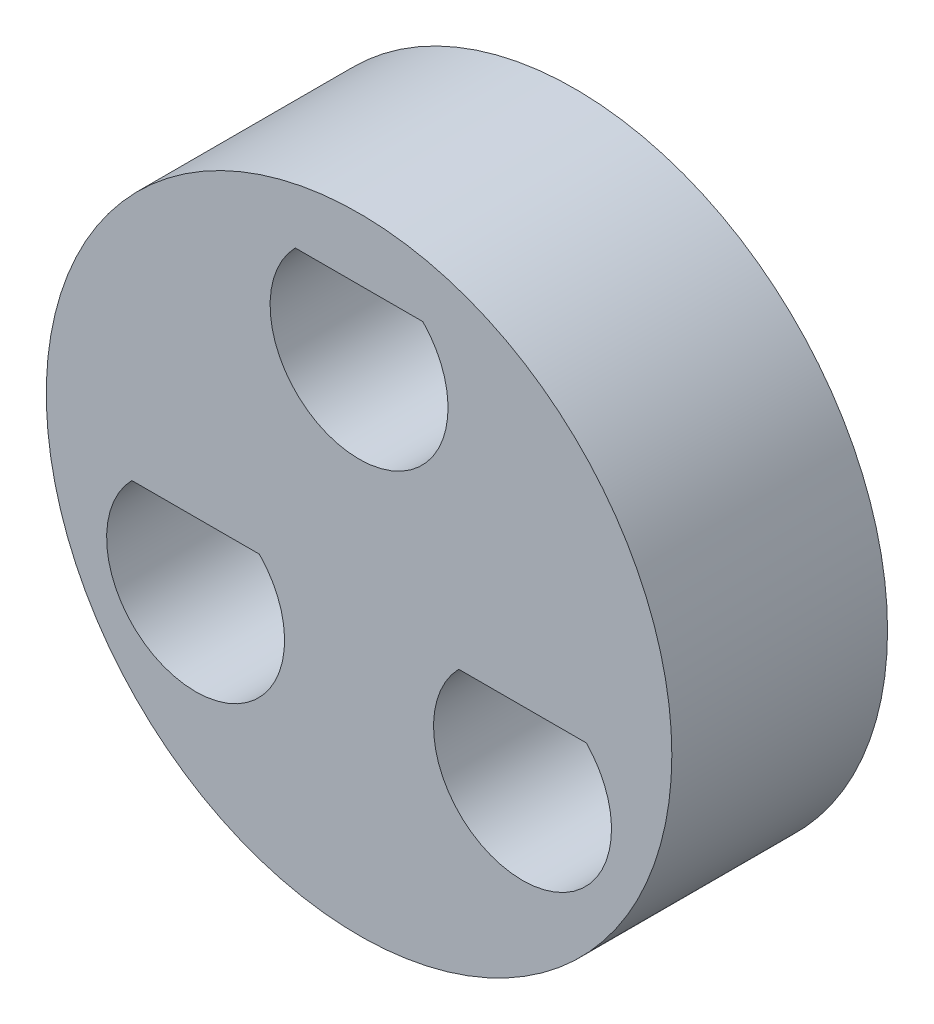
ISO-10303-21;
HEADER;
FILE_DESCRIPTION(('STEP AP214'),'2;1');
FILE_NAME('part.step','',(''),(''),'','','');
FILE_SCHEMA(('AUTOMOTIVE_DESIGN { 1 0 10303 214 1 1 1 1 }'));
ENDSEC;
DATA;
#1=APPLICATION_CONTEXT('core data for automotive mechanical design processes');
#2=APPLICATION_PROTOCOL_DEFINITION('international standard','automotive_design',2000,#1);
#3=PRODUCT_CONTEXT('',#1,'mechanical');
#4=PRODUCT('Part','Part','',(#3));
#5=PRODUCT_RELATED_PRODUCT_CATEGORY('part','',(#4));
#6=PRODUCT_DEFINITION_FORMATION('','',#4);
#7=PRODUCT_DEFINITION_CONTEXT('part definition',#1,'design');
#8=PRODUCT_DEFINITION('design','',#6,#7);
#9=PRODUCT_DEFINITION_SHAPE('','',#8);
#10=(LENGTH_UNIT() NAMED_UNIT(*) SI_UNIT(.MILLI.,.METRE.));
#11=(NAMED_UNIT(*) PLANE_ANGLE_UNIT() SI_UNIT($,.RADIAN.));
#12=(NAMED_UNIT(*) SI_UNIT($,.STERADIAN.) SOLID_ANGLE_UNIT());
#13=UNCERTAINTY_MEASURE_WITH_UNIT(LENGTH_MEASURE(1.E-05),#10,'distance_accuracy_value','');
#14=(GEOMETRIC_REPRESENTATION_CONTEXT(3) GLOBAL_UNCERTAINTY_ASSIGNED_CONTEXT((#13)) GLOBAL_UNIT_ASSIGNED_CONTEXT((#10,
#11,#12)) REPRESENTATION_CONTEXT('',''));
#15=CARTESIAN_POINT('',(0.,0.,0.));
#16=DIRECTION('',(0.,0.,1.));
#17=DIRECTION('',(1.,0.,0.));
#18=AXIS2_PLACEMENT_3D('',#15,#16,#17);
#19=CARTESIAN_POINT('',(0.,0.,-2.));
#20=DIRECTION('',(0.,0.,1.));
#21=DIRECTION('',(1.,0.,0.));
#22=AXIS2_PLACEMENT_3D('',#19,#20,#21);
#23=PLANE('',#22);
#24=DIRECTION('',(1.,0.,0.));
#25=VECTOR('',#24,1.);
#26=CARTESIAN_POINT('',(0.,-0.600000000000015,-2.));
#27=LINE('',#26,#25);
#28=CARTESIAN_POINT('',(-4.21430486986545,-0.600000000000015,-2.));
#29=VERTEX_POINT('',#28);
#30=CARTESIAN_POINT('',(-1.8478729566256,-0.600000000000015,-2.));
#31=VERTEX_POINT('',#30);
#32=EDGE_CURVE('E101',#29,#31,#27,.T.);
#33=ORIENTED_EDGE('',*,*,#32,.F.);
#34=CARTESIAN_POINT('',(-3.03108891324553,-1.75000000000001,-2.));
#35=DIRECTION('',(0.,0.,1.));
#36=DIRECTION('',(1.,0.,0.));
#37=AXIS2_PLACEMENT_3D('',#34,#35,#36);
#38=CIRCLE('',#37,1.65);
#39=EDGE_CURVE('E107',#29,#31,#38,.T.);
#40=ORIENTED_EDGE('',*,*,#39,.T.);
#41=EDGE_LOOP('',(#33,#40));
#42=FACE_BOUND('',#41,.T.);
#43=CARTESIAN_POINT('',(3.03108891324553,-1.75000000000001,-2.));
#44=DIRECTION('',(0.,0.,1.));
#45=DIRECTION('',(1.,0.,0.));
#46=AXIS2_PLACEMENT_3D('',#43,#44,#45);
#47=CIRCLE('',#46,1.65);
#48=CARTESIAN_POINT('',(1.8478729566256,-0.600000000000015,-2.));
#49=VERTEX_POINT('',#48);
#50=CARTESIAN_POINT('',(4.21430486986545,-0.600000000000014,-2.));
#51=VERTEX_POINT('',#50);
#52=EDGE_CURVE('E149',#49,#51,#47,.T.);
#53=ORIENTED_EDGE('',*,*,#52,.T.);
#54=DIRECTION('',(-1.,0.,0.));
#55=VECTOR('',#54,1.);
#56=CARTESIAN_POINT('',(0.,-0.600000000000016,-2.));
#57=LINE('',#56,#55);
#58=EDGE_CURVE('E145',#51,#49,#57,.T.);
#59=ORIENTED_EDGE('',*,*,#58,.T.);
#60=EDGE_LOOP('',(#53,#59));
#61=FACE_BOUND('',#60,.T.);
#62=CARTESIAN_POINT('',(0.,0.,-2.));
#63=DIRECTION('',(0.,0.,1.));
#64=DIRECTION('',(1.,0.,0.));
#65=AXIS2_PLACEMENT_3D('',#62,#63,#64);
#66=CIRCLE('',#65,5.8);
#67=CARTESIAN_POINT('',(5.8,0.,-2.));
#68=VERTEX_POINT('',#67);
#69=EDGE_CURVE('E11',#68,#68,#66,.T.);
#70=ORIENTED_EDGE('',*,*,#69,.F.);
#71=EDGE_LOOP('',(#70));
#72=FACE_BOUND('',#71,.T.);
#73=DIRECTION('',(1.,0.,0.));
#74=VECTOR('',#73,1.);
#75=CARTESIAN_POINT('',(0.,4.65,-2.));
#76=LINE('',#75,#74);
#77=CARTESIAN_POINT('',(-1.18321595661992,4.65,-2.));
#78=VERTEX_POINT('',#77);
#79=CARTESIAN_POINT('',(1.18321595661992,4.65,-2.));
#80=VERTEX_POINT('',#79);
#81=EDGE_CURVE('E125',#78,#80,#76,.T.);
#82=ORIENTED_EDGE('',*,*,#81,.F.);
#83=CARTESIAN_POINT('',(0.,3.5,-2.));
#84=DIRECTION('',(0.,0.,1.));
#85=DIRECTION('',(1.,0.,0.));
#86=AXIS2_PLACEMENT_3D('',#83,#84,#85);
#87=CIRCLE('',#86,1.65);
#88=EDGE_CURVE('E128',#78,#80,#87,.T.);
#89=ORIENTED_EDGE('',*,*,#88,.T.);
#90=EDGE_LOOP('',(#82,#89));
#91=FACE_BOUND('',#90,.T.);
#92=ADVANCED_FACE('F43',(#42,#61,#72,#91),#23,.F.);
#93=CARTESIAN_POINT('',(0.,0.,2.));
#94=DIRECTION('',(0.,0.,1.));
#95=DIRECTION('',(1.,0.,0.));
#96=AXIS2_PLACEMENT_3D('',#93,#94,#95);
#97=PLANE('',#96);
#98=DIRECTION('',(-1.,0.,0.));
#99=VECTOR('',#98,1.);
#100=CARTESIAN_POINT('',(0.,-0.600000000000016,2.));
#101=LINE('',#100,#99);
#102=CARTESIAN_POINT('',(4.21430486986545,-0.600000000000015,2.));
#103=VERTEX_POINT('',#102);
#104=CARTESIAN_POINT('',(1.8478729566256,-0.600000000000015,2.));
#105=VERTEX_POINT('',#104);
#106=EDGE_CURVE('E123',#103,#105,#101,.T.);
#107=ORIENTED_EDGE('',*,*,#106,.F.);
#108=CARTESIAN_POINT('',(3.03108891324553,-1.75000000000001,2.));
#109=DIRECTION('',(0.,0.,1.));
#110=DIRECTION('',(1.,0.,0.));
#111=AXIS2_PLACEMENT_3D('',#108,#109,#110);
#112=CIRCLE('',#111,1.65);
#113=EDGE_CURVE('E150',#105,#103,#112,.T.);
#114=ORIENTED_EDGE('',*,*,#113,.F.);
#115=EDGE_LOOP('',(#107,#114));
#116=FACE_BOUND('',#115,.T.);
#117=CARTESIAN_POINT('',(0.,0.,2.));
#118=DIRECTION('',(0.,0.,1.));
#119=DIRECTION('',(1.,0.,0.));
#120=AXIS2_PLACEMENT_3D('',#117,#118,#119);
#121=CIRCLE('',#120,5.8);
#122=CARTESIAN_POINT('',(5.8,0.,2.));
#123=VERTEX_POINT('',#122);
#124=EDGE_CURVE('E47',#123,#123,#121,.T.);
#125=ORIENTED_EDGE('',*,*,#124,.T.);
#126=EDGE_LOOP('',(#125));
#127=FACE_BOUND('',#126,.T.);
#128=CARTESIAN_POINT('',(-3.03108891324553,-1.75000000000001,2.));
#129=DIRECTION('',(0.,0.,1.));
#130=DIRECTION('',(1.,0.,0.));
#131=AXIS2_PLACEMENT_3D('',#128,#129,#130);
#132=CIRCLE('',#131,1.65);
#133=CARTESIAN_POINT('',(-4.21430486986545,-0.600000000000014,2.));
#134=VERTEX_POINT('',#133);
#135=CARTESIAN_POINT('',(-1.8478729566256,-0.600000000000015,2.));
#136=VERTEX_POINT('',#135);
#137=EDGE_CURVE('E115',#134,#136,#132,.T.);
#138=ORIENTED_EDGE('',*,*,#137,.F.);
#139=DIRECTION('',(1.,0.,0.));
#140=VECTOR('',#139,1.);
#141=CARTESIAN_POINT('',(0.,-0.600000000000015,2.));
#142=LINE('',#141,#140);
#143=EDGE_CURVE('E104',#134,#136,#142,.T.);
#144=ORIENTED_EDGE('',*,*,#143,.T.);
#145=EDGE_LOOP('',(#138,#144));
#146=FACE_BOUND('',#145,.T.);
#147=CARTESIAN_POINT('',(0.,3.5,2.));
#148=DIRECTION('',(0.,0.,1.));
#149=DIRECTION('',(1.,0.,0.));
#150=AXIS2_PLACEMENT_3D('',#147,#148,#149);
#151=CIRCLE('',#150,1.65);
#152=CARTESIAN_POINT('',(-1.18321595661992,4.65,2.));
#153=VERTEX_POINT('',#152);
#154=CARTESIAN_POINT('',(1.18321595661992,4.65,2.));
#155=VERTEX_POINT('',#154);
#156=EDGE_CURVE('E129',#153,#155,#151,.T.);
#157=ORIENTED_EDGE('',*,*,#156,.F.);
#158=DIRECTION('',(1.,0.,0.));
#159=VECTOR('',#158,1.);
#160=CARTESIAN_POINT('',(0.,4.65,2.));
#161=LINE('',#160,#159);
#162=EDGE_CURVE('E134',#153,#155,#161,.T.);
#163=ORIENTED_EDGE('',*,*,#162,.T.);
#164=EDGE_LOOP('',(#157,#163));
#165=FACE_BOUND('',#164,.T.);
#166=ADVANCED_FACE('F173',(#116,#127,#146,#165),#97,.T.);
#167=CARTESIAN_POINT('',(0.,0.,-2.));
#168=DIRECTION('',(0.,0.,1.));
#169=DIRECTION('',(1.,0.,0.));
#170=AXIS2_PLACEMENT_3D('',#167,#168,#169);
#171=CYLINDRICAL_SURFACE('',#170,5.8);
#172=ORIENTED_EDGE('',*,*,#69,.T.);
#173=EDGE_LOOP('',(#172));
#174=FACE_BOUND('',#173,.T.);
#175=ORIENTED_EDGE('',*,*,#124,.F.);
#176=EDGE_LOOP('',(#175));
#177=FACE_BOUND('',#176,.T.);
#178=ADVANCED_FACE('F45',(#174,#177),#171,.T.);
#179=CARTESIAN_POINT('',(0.,-0.600000000000016,-2.));
#180=DIRECTION('',(0.,1.,0.));
#181=DIRECTION('',(-1.,0.,0.));
#182=AXIS2_PLACEMENT_3D('',#179,#180,#181);
#183=PLANE('',#182);
#184=ORIENTED_EDGE('',*,*,#106,.T.);
#185=DIRECTION('',(0.,0.,1.));
#186=VECTOR('',#185,1.);
#187=CARTESIAN_POINT('',(1.8478729566256,-0.600000000000015,-2.));
#188=LINE('',#187,#186);
#189=EDGE_CURVE('E154',#49,#105,#188,.T.);
#190=ORIENTED_EDGE('',*,*,#189,.F.);
#191=ORIENTED_EDGE('',*,*,#58,.F.);
#192=DIRECTION('',(0.,0.,1.));
#193=VECTOR('',#192,1.);
#194=CARTESIAN_POINT('',(4.21430486986545,-0.600000000000015,-2.));
#195=LINE('',#194,#193);
#196=EDGE_CURVE('E160',#51,#103,#195,.T.);
#197=ORIENTED_EDGE('',*,*,#196,.T.);
#198=EDGE_LOOP('',(#184,#190,#191,#197));
#199=FACE_BOUND('',#198,.T.);
#200=ADVANCED_FACE('F175',(#199),#183,.F.);
#201=CARTESIAN_POINT('',(3.03108891324553,-1.75000000000001,-2.));
#202=DIRECTION('',(0.,0.,1.));
#203=DIRECTION('',(1.,0.,0.));
#204=AXIS2_PLACEMENT_3D('',#201,#202,#203);
#205=CYLINDRICAL_SURFACE('',#204,1.65);
#206=ORIENTED_EDGE('',*,*,#113,.T.);
#207=ORIENTED_EDGE('',*,*,#196,.F.);
#208=ORIENTED_EDGE('',*,*,#52,.F.);
#209=ORIENTED_EDGE('',*,*,#189,.T.);
#210=EDGE_LOOP('',(#206,#207,#208,#209));
#211=FACE_BOUND('',#210,.T.);
#212=ADVANCED_FACE('F168',(#211),#205,.F.);
#213=CARTESIAN_POINT('',(0.,-0.600000000000015,-2.));
#214=DIRECTION('',(0.,-1.,0.));
#215=DIRECTION('',(0.,0.,-1.));
#216=AXIS2_PLACEMENT_3D('',#213,#214,#215);
#217=PLANE('',#216);
#218=ORIENTED_EDGE('',*,*,#143,.F.);
#219=DIRECTION('',(0.,0.,1.));
#220=VECTOR('',#219,1.);
#221=CARTESIAN_POINT('',(-4.21430486986545,-0.600000000000015,-2.));
#222=LINE('',#221,#220);
#223=EDGE_CURVE('E98',#29,#134,#222,.T.);
#224=ORIENTED_EDGE('',*,*,#223,.F.);
#225=ORIENTED_EDGE('',*,*,#32,.T.);
#226=DIRECTION('',(0.,0.,1.));
#227=VECTOR('',#226,1.);
#228=CARTESIAN_POINT('',(-1.8478729566256,-0.600000000000015,-2.));
#229=LINE('',#228,#227);
#230=EDGE_CURVE('E67',#31,#136,#229,.T.);
#231=ORIENTED_EDGE('',*,*,#230,.T.);
#232=EDGE_LOOP('',(#218,#224,#225,#231));
#233=FACE_BOUND('',#232,.T.);
#234=ADVANCED_FACE('F99',(#233),#217,.T.);
#235=CARTESIAN_POINT('',(-3.03108891324553,-1.75000000000001,-2.));
#236=DIRECTION('',(0.,0.,1.));
#237=DIRECTION('',(1.,0.,0.));
#238=AXIS2_PLACEMENT_3D('',#235,#236,#237);
#239=CYLINDRICAL_SURFACE('',#238,1.65);
#240=ORIENTED_EDGE('',*,*,#137,.T.);
#241=ORIENTED_EDGE('',*,*,#230,.F.);
#242=ORIENTED_EDGE('',*,*,#39,.F.);
#243=ORIENTED_EDGE('',*,*,#223,.T.);
#244=EDGE_LOOP('',(#240,#241,#242,#243));
#245=FACE_BOUND('',#244,.T.);
#246=ADVANCED_FACE('F109',(#245),#239,.F.);
#247=CARTESIAN_POINT('',(0.,4.65,-2.));
#248=DIRECTION('',(0.,-1.,0.));
#249=DIRECTION('',(0.,0.,-1.));
#250=AXIS2_PLACEMENT_3D('',#247,#248,#249);
#251=PLANE('',#250);
#252=ORIENTED_EDGE('',*,*,#162,.F.);
#253=DIRECTION('',(0.,0.,1.));
#254=VECTOR('',#253,1.);
#255=CARTESIAN_POINT('',(-1.18321595661992,4.65,-2.));
#256=LINE('',#255,#254);
#257=EDGE_CURVE('E133',#78,#153,#256,.T.);
#258=ORIENTED_EDGE('',*,*,#257,.F.);
#259=ORIENTED_EDGE('',*,*,#81,.T.);
#260=DIRECTION('',(0.,0.,1.));
#261=VECTOR('',#260,1.);
#262=CARTESIAN_POINT('',(1.18321595661992,4.65,-2.));
#263=LINE('',#262,#261);
#264=EDGE_CURVE('E59',#80,#155,#263,.T.);
#265=ORIENTED_EDGE('',*,*,#264,.T.);
#266=EDGE_LOOP('',(#252,#258,#259,#265));
#267=FACE_BOUND('',#266,.T.);
#268=ADVANCED_FACE('F183',(#267),#251,.T.);
#269=CARTESIAN_POINT('',(0.,3.5,-2.));
#270=DIRECTION('',(0.,0.,1.));
#271=DIRECTION('',(1.,0.,0.));
#272=AXIS2_PLACEMENT_3D('',#269,#270,#271);
#273=CYLINDRICAL_SURFACE('',#272,1.65);
#274=ORIENTED_EDGE('',*,*,#156,.T.);
#275=ORIENTED_EDGE('',*,*,#264,.F.);
#276=ORIENTED_EDGE('',*,*,#88,.F.);
#277=ORIENTED_EDGE('',*,*,#257,.T.);
#278=EDGE_LOOP('',(#274,#275,#276,#277));
#279=FACE_BOUND('',#278,.T.);
#280=ADVANCED_FACE('F185',(#279),#273,.F.);
#281=CLOSED_SHELL('',(#92,#166,#178,#200,#212,#234,#246,#268,#280));
#282=MANIFOLD_SOLID_BREP('B2',#281);
#283=ADVANCED_BREP_SHAPE_REPRESENTATION('',(#18,#282),#14);
#284=SHAPE_DEFINITION_REPRESENTATION(#9,#283);
ENDSEC;
END-ISO-10303-21;
